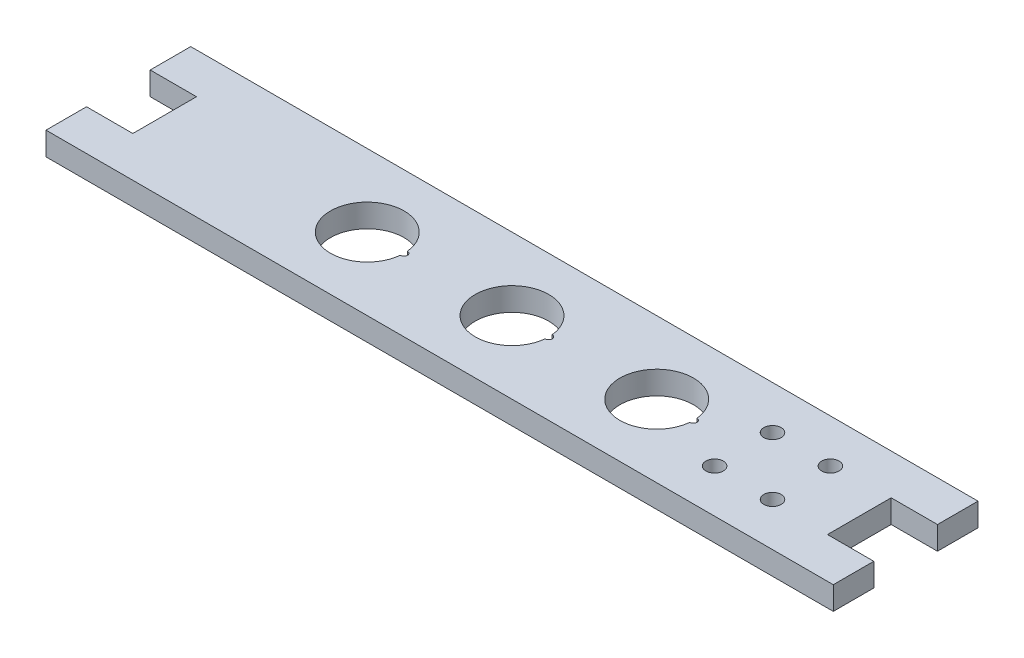
ISO-10303-21;
HEADER;
FILE_DESCRIPTION(('STEP AP214'),'2;1');
FILE_NAME('part.step','',(''),(''),'','','');
FILE_SCHEMA(('AUTOMOTIVE_DESIGN { 1 0 10303 214 1 1 1 1 }'));
ENDSEC;
DATA;
#1=APPLICATION_CONTEXT('core data for automotive mechanical design processes');
#2=APPLICATION_PROTOCOL_DEFINITION('international standard','automotive_design',2000,#1);
#3=PRODUCT_CONTEXT('',#1,'mechanical');
#4=PRODUCT('Part','Part','',(#3));
#5=PRODUCT_RELATED_PRODUCT_CATEGORY('part','',(#4));
#6=PRODUCT_DEFINITION_FORMATION('','',#4);
#7=PRODUCT_DEFINITION_CONTEXT('part definition',#1,'design');
#8=PRODUCT_DEFINITION('design','',#6,#7);
#9=PRODUCT_DEFINITION_SHAPE('','',#8);
#10=(LENGTH_UNIT() NAMED_UNIT(*) SI_UNIT(.MILLI.,.METRE.));
#11=(NAMED_UNIT(*) PLANE_ANGLE_UNIT() SI_UNIT($,.RADIAN.));
#12=(NAMED_UNIT(*) SI_UNIT($,.STERADIAN.) SOLID_ANGLE_UNIT());
#13=UNCERTAINTY_MEASURE_WITH_UNIT(LENGTH_MEASURE(1.E-05),#10,'distance_accuracy_value','');
#14=(GEOMETRIC_REPRESENTATION_CONTEXT(3) GLOBAL_UNCERTAINTY_ASSIGNED_CONTEXT((#13)) GLOBAL_UNIT_ASSIGNED_CONTEXT((#10,
#11,#12)) REPRESENTATION_CONTEXT('',''));
#15=CARTESIAN_POINT('',(0.,0.,0.));
#16=DIRECTION('',(0.,0.,1.));
#17=DIRECTION('',(1.,0.,0.));
#18=AXIS2_PLACEMENT_3D('',#15,#16,#17);
#19=CARTESIAN_POINT('',(-60.,4.,-12.5));
#20=DIRECTION('',(1.,0.,0.));
#21=DIRECTION('',(0.,0.,-1.));
#22=AXIS2_PLACEMENT_3D('',#19,#20,#21);
#23=PLANE('',#22);
#24=DIRECTION('',(0.,-1.,0.));
#25=VECTOR('',#24,1.);
#26=CARTESIAN_POINT('',(-60.,0.,5.49999999999997));
#27=LINE('',#26,#25);
#28=CARTESIAN_POINT('',(-60.,4.,5.49999999999997));
#29=VERTEX_POINT('',#28);
#30=CARTESIAN_POINT('',(-60.,0.,5.49999999999997));
#31=VERTEX_POINT('',#30);
#32=EDGE_CURVE('E207',#29,#31,#27,.T.);
#33=ORIENTED_EDGE('',*,*,#32,.F.);
#34=DIRECTION('',(0.,0.,1.));
#35=VECTOR('',#34,1.);
#36=CARTESIAN_POINT('',(-60.,4.,-12.5));
#37=LINE('',#36,#35);
#38=CARTESIAN_POINT('',(-60.,4.,-5.49999999999997));
#39=VERTEX_POINT('',#38);
#40=EDGE_CURVE('E319',#39,#29,#37,.T.);
#41=ORIENTED_EDGE('',*,*,#40,.F.);
#42=DIRECTION('',(0.,1.,0.));
#43=VECTOR('',#42,1.);
#44=CARTESIAN_POINT('',(-60.,0.,-5.49999999999997));
#45=LINE('',#44,#43);
#46=CARTESIAN_POINT('',(-60.,0.,-5.49999999999997));
#47=VERTEX_POINT('',#46);
#48=EDGE_CURVE('E224',#47,#39,#45,.T.);
#49=ORIENTED_EDGE('',*,*,#48,.F.);
#50=DIRECTION('',(0.,0.,1.));
#51=VECTOR('',#50,1.);
#52=CARTESIAN_POINT('',(-60.,0.,-12.5));
#53=LINE('',#52,#51);
#54=EDGE_CURVE('E318',#47,#31,#53,.T.);
#55=ORIENTED_EDGE('',*,*,#54,.T.);
#56=EDGE_LOOP('',(#33,#41,#49,#55));
#57=FACE_BOUND('',#56,.T.);
#58=ADVANCED_FACE('F35',(#57),#23,.F.);
#59=CARTESIAN_POINT('',(0.,4.,0.));
#60=DIRECTION('',(0.,1.,0.));
#61=DIRECTION('',(0.,0.,1.));
#62=AXIS2_PLACEMENT_3D('',#59,#60,#61);
#63=PLANE('',#62);
#64=CARTESIAN_POINT('',(50.,4.,-5.));
#65=DIRECTION('',(0.,1.,0.));
#66=DIRECTION('',(0.,0.,1.));
#67=AXIS2_PLACEMENT_3D('',#64,#65,#66);
#68=CIRCLE('',#67,1.5);
#69=CARTESIAN_POINT('',(50.,4.,-3.5));
#70=VERTEX_POINT('',#69);
#71=EDGE_CURVE('E250',#70,#70,#68,.T.);
#72=ORIENTED_EDGE('',*,*,#71,.F.);
#73=EDGE_LOOP('',(#72));
#74=FACE_BOUND('',#73,.T.);
#75=CARTESIAN_POINT('',(40.,4.,-5.));
#76=DIRECTION('',(0.,1.,0.));
#77=DIRECTION('',(0.,0.,1.));
#78=AXIS2_PLACEMENT_3D('',#75,#76,#77);
#79=CIRCLE('',#78,1.5);
#80=CARTESIAN_POINT('',(40.,4.,-3.5));
#81=VERTEX_POINT('',#80);
#82=EDGE_CURVE('E262',#81,#81,#79,.T.);
#83=ORIENTED_EDGE('',*,*,#82,.F.);
#84=EDGE_LOOP('',(#83));
#85=FACE_BOUND('',#84,.T.);
#86=DIRECTION('',(-1.,0.,0.));
#87=VECTOR('',#86,1.);
#88=CARTESIAN_POINT('',(-60.,4.,-12.5));
#89=LINE('',#88,#87);
#90=CARTESIAN_POINT('',(68.,4.,-12.5));
#91=VERTEX_POINT('',#90);
#92=CARTESIAN_POINT('',(-68.,4.,-12.5));
#93=VERTEX_POINT('',#92);
#94=EDGE_CURVE('E11',#91,#93,#89,.T.);
#95=ORIENTED_EDGE('',*,*,#94,.T.);
#96=DIRECTION('',(0.,0.,-1.));
#97=VECTOR('',#96,1.);
#98=CARTESIAN_POINT('',(-68.,4.,-12.5));
#99=LINE('',#98,#97);
#100=CARTESIAN_POINT('',(-68.,4.,-5.49999999999997));
#101=VERTEX_POINT('',#100);
#102=EDGE_CURVE('E232',#101,#93,#99,.T.);
#103=ORIENTED_EDGE('',*,*,#102,.F.);
#104=DIRECTION('',(1.,0.,0.));
#105=VECTOR('',#104,1.);
#106=CARTESIAN_POINT('',(-68.,4.,-5.49999999999997));
#107=LINE('',#106,#105);
#108=EDGE_CURVE('E235',#101,#39,#107,.T.);
#109=ORIENTED_EDGE('',*,*,#108,.T.);
#110=ORIENTED_EDGE('',*,*,#40,.T.);
#111=DIRECTION('',(1.,0.,0.));
#112=VECTOR('',#111,1.);
#113=CARTESIAN_POINT('',(-68.,4.,5.49999999999997));
#114=LINE('',#113,#112);
#115=CARTESIAN_POINT('',(-68.,4.,5.49999999999997));
#116=VERTEX_POINT('',#115);
#117=EDGE_CURVE('E222',#116,#29,#114,.T.);
#118=ORIENTED_EDGE('',*,*,#117,.F.);
#119=DIRECTION('',(0.,0.,-1.));
#120=VECTOR('',#119,1.);
#121=CARTESIAN_POINT('',(-68.,4.,12.5));
#122=LINE('',#121,#120);
#123=CARTESIAN_POINT('',(-68.,4.,12.5));
#124=VERTEX_POINT('',#123);
#125=EDGE_CURVE('E214',#124,#116,#122,.T.);
#126=ORIENTED_EDGE('',*,*,#125,.F.);
#127=DIRECTION('',(1.,0.,0.));
#128=VECTOR('',#127,1.);
#129=CARTESIAN_POINT('',(-60.,4.,12.5));
#130=LINE('',#129,#128);
#131=CARTESIAN_POINT('',(68.,4.,12.5));
#132=VERTEX_POINT('',#131);
#133=EDGE_CURVE('E322',#124,#132,#130,.T.);
#134=ORIENTED_EDGE('',*,*,#133,.T.);
#135=DIRECTION('',(0.,0.,-1.));
#136=VECTOR('',#135,1.);
#137=CARTESIAN_POINT('',(68.,4.,12.5));
#138=LINE('',#137,#136);
#139=CARTESIAN_POINT('',(68.,4.,5.49999999999997));
#140=VERTEX_POINT('',#139);
#141=EDGE_CURVE('E182',#132,#140,#138,.T.);
#142=ORIENTED_EDGE('',*,*,#141,.T.);
#143=DIRECTION('',(-1.,0.,0.));
#144=VECTOR('',#143,1.);
#145=CARTESIAN_POINT('',(68.,4.,5.49999999999997));
#146=LINE('',#145,#144);
#147=CARTESIAN_POINT('',(60.,4.,5.49999999999997));
#148=VERTEX_POINT('',#147);
#149=EDGE_CURVE('E170',#140,#148,#146,.T.);
#150=ORIENTED_EDGE('',*,*,#149,.T.);
#151=DIRECTION('',(0.,0.,-1.));
#152=VECTOR('',#151,1.);
#153=CARTESIAN_POINT('',(60.,4.,-12.5));
#154=LINE('',#153,#152);
#155=CARTESIAN_POINT('',(60.,4.,-5.49999999999997));
#156=VERTEX_POINT('',#155);
#157=EDGE_CURVE('E43',#148,#156,#154,.T.);
#158=ORIENTED_EDGE('',*,*,#157,.T.);
#159=DIRECTION('',(-1.,0.,0.));
#160=VECTOR('',#159,1.);
#161=CARTESIAN_POINT('',(68.,4.,-5.49999999999997));
#162=LINE('',#161,#160);
#163=CARTESIAN_POINT('',(68.,4.,-5.49999999999997));
#164=VERTEX_POINT('',#163);
#165=EDGE_CURVE('E204',#164,#156,#162,.T.);
#166=ORIENTED_EDGE('',*,*,#165,.F.);
#167=DIRECTION('',(0.,0.,-1.));
#168=VECTOR('',#167,1.);
#169=CARTESIAN_POINT('',(68.,4.,-12.5));
#170=LINE('',#169,#168);
#171=EDGE_CURVE('E192',#164,#91,#170,.T.);
#172=ORIENTED_EDGE('',*,*,#171,.T.);
#173=EDGE_LOOP('',(#95,#103,#109,#110,#118,#126,#134,#142,#150,#158,#166,#172));
#174=FACE_BOUND('',#173,.T.);
#175=CARTESIAN_POINT('',(31.35,4.,-1.74574066942157E-13));
#176=DIRECTION('',(0.,1.,0.));
#177=DIRECTION('',(0.,0.,-1.));
#178=AXIS2_PLACEMENT_3D('',#175,#176,#177);
#179=CIRCLE('',#178,0.6);
#180=CARTESIAN_POINT('',(31.3216535433071,4.,0.599330024604764));
#181=VERTEX_POINT('',#180);
#182=CARTESIAN_POINT('',(31.3216535433071,4.,-0.599330024605113));
#183=VERTEX_POINT('',#182);
#184=EDGE_CURVE('E305',#181,#183,#179,.T.);
#185=ORIENTED_EDGE('',*,*,#184,.F.);
#186=CARTESIAN_POINT('',(25.,4.,-1.74574066942157E-13));
#187=DIRECTION('',(0.,1.,0.));
#188=DIRECTION('',(0.,0.,1.));
#189=AXIS2_PLACEMENT_3D('',#186,#187,#188);
#190=CIRCLE('',#189,6.35);
#191=EDGE_CURVE('E302',#183,#181,#190,.T.);
#192=ORIENTED_EDGE('',*,*,#191,.F.);
#193=EDGE_LOOP('',(#185,#192));
#194=FACE_BOUND('',#193,.T.);
#195=CARTESIAN_POINT('',(6.35,4.,0.));
#196=DIRECTION('',(0.,1.,0.));
#197=DIRECTION('',(0.,0.,-1.));
#198=AXIS2_PLACEMENT_3D('',#195,#196,#197);
#199=CIRCLE('',#198,0.6);
#200=CARTESIAN_POINT('',(6.32165354330708,4.,0.599330024604939));
#201=VERTEX_POINT('',#200);
#202=CARTESIAN_POINT('',(6.32165354330708,4.,-0.599330024604939));
#203=VERTEX_POINT('',#202);
#204=EDGE_CURVE('E288',#201,#203,#199,.T.);
#205=ORIENTED_EDGE('',*,*,#204,.F.);
#206=CARTESIAN_POINT('',(0.,4.,0.));
#207=DIRECTION('',(0.,1.,0.));
#208=DIRECTION('',(0.,0.,1.));
#209=AXIS2_PLACEMENT_3D('',#206,#207,#208);
#210=CIRCLE('',#209,6.35);
#211=EDGE_CURVE('E285',#203,#201,#210,.T.);
#212=ORIENTED_EDGE('',*,*,#211,.F.);
#213=EDGE_LOOP('',(#205,#212));
#214=FACE_BOUND('',#213,.T.);
#215=CARTESIAN_POINT('',(-18.65,4.,1.74574066942157E-13));
#216=DIRECTION('',(0.,1.,0.));
#217=DIRECTION('',(0.,0.,-1.));
#218=AXIS2_PLACEMENT_3D('',#215,#216,#217);
#219=CIRCLE('',#218,0.6);
#220=CARTESIAN_POINT('',(-18.6783464566929,4.,0.599330024605113));
#221=VERTEX_POINT('',#220);
#222=CARTESIAN_POINT('',(-18.6783464566929,4.,-0.599330024604764));
#223=VERTEX_POINT('',#222);
#224=EDGE_CURVE('E271',#221,#223,#219,.T.);
#225=ORIENTED_EDGE('',*,*,#224,.F.);
#226=CARTESIAN_POINT('',(-25.,4.,1.74574066942157E-13));
#227=DIRECTION('',(0.,1.,0.));
#228=DIRECTION('',(0.,0.,1.));
#229=AXIS2_PLACEMENT_3D('',#226,#227,#228);
#230=CIRCLE('',#229,6.35);
#231=EDGE_CURVE('E268',#223,#221,#230,.T.);
#232=ORIENTED_EDGE('',*,*,#231,.F.);
#233=EDGE_LOOP('',(#225,#232));
#234=FACE_BOUND('',#233,.T.);
#235=CARTESIAN_POINT('',(40.,4.,5.));
#236=DIRECTION('',(0.,1.,0.));
#237=DIRECTION('',(0.,0.,-1.));
#238=AXIS2_PLACEMENT_3D('',#235,#236,#237);
#239=CIRCLE('',#238,1.5);
#240=CARTESIAN_POINT('',(40.,4.,3.5));
#241=VERTEX_POINT('',#240);
#242=EDGE_CURVE('E256',#241,#241,#239,.T.);
#243=ORIENTED_EDGE('',*,*,#242,.F.);
#244=EDGE_LOOP('',(#243));
#245=FACE_BOUND('',#244,.T.);
#246=CARTESIAN_POINT('',(50.,4.,5.));
#247=DIRECTION('',(0.,1.,0.));
#248=DIRECTION('',(0.,0.,-1.));
#249=AXIS2_PLACEMENT_3D('',#246,#247,#248);
#250=CIRCLE('',#249,1.5);
#251=CARTESIAN_POINT('',(50.,4.,3.5));
#252=VERTEX_POINT('',#251);
#253=EDGE_CURVE('E244',#252,#252,#250,.T.);
#254=ORIENTED_EDGE('',*,*,#253,.F.);
#255=EDGE_LOOP('',(#254));
#256=FACE_BOUND('',#255,.T.);
#257=ADVANCED_FACE('F341',(#74,#85,#174,#194,#214,#234,#245,#256),#63,.T.);
#258=CARTESIAN_POINT('',(0.,0.,0.));
#259=DIRECTION('',(0.,1.,0.));
#260=DIRECTION('',(0.,0.,1.));
#261=AXIS2_PLACEMENT_3D('',#258,#259,#260);
#262=PLANE('',#261);
#263=CARTESIAN_POINT('',(0.,0.,0.));
#264=DIRECTION('',(0.,1.,0.));
#265=DIRECTION('',(0.,0.,1.));
#266=AXIS2_PLACEMENT_3D('',#263,#264,#265);
#267=CIRCLE('',#266,6.35);
#268=CARTESIAN_POINT('',(6.32165354330708,0.,-0.599330024604939));
#269=VERTEX_POINT('',#268);
#270=CARTESIAN_POINT('',(6.32165354330708,0.,0.599330024604939));
#271=VERTEX_POINT('',#270);
#272=EDGE_CURVE('E284',#269,#271,#267,.T.);
#273=ORIENTED_EDGE('',*,*,#272,.T.);
#274=CARTESIAN_POINT('',(6.35,0.,0.));
#275=DIRECTION('',(0.,1.,0.));
#276=DIRECTION('',(0.,0.,-1.));
#277=AXIS2_PLACEMENT_3D('',#274,#275,#276);
#278=CIRCLE('',#277,0.6);
#279=EDGE_CURVE('E289',#271,#269,#278,.T.);
#280=ORIENTED_EDGE('',*,*,#279,.T.);
#281=EDGE_LOOP('',(#273,#280));
#282=FACE_BOUND('',#281,.T.);
#283=ORIENTED_EDGE('',*,*,#54,.F.);
#284=DIRECTION('',(1.,0.,0.));
#285=VECTOR('',#284,1.);
#286=CARTESIAN_POINT('',(-68.,0.,-5.49999999999997));
#287=LINE('',#286,#285);
#288=CARTESIAN_POINT('',(-68.,0.,-5.49999999999997));
#289=VERTEX_POINT('',#288);
#290=EDGE_CURVE('E240',#289,#47,#287,.T.);
#291=ORIENTED_EDGE('',*,*,#290,.F.);
#292=DIRECTION('',(0.,0.,1.));
#293=VECTOR('',#292,1.);
#294=CARTESIAN_POINT('',(-68.,0.,-12.5));
#295=LINE('',#294,#293);
#296=CARTESIAN_POINT('',(-68.,0.,-12.5));
#297=VERTEX_POINT('',#296);
#298=EDGE_CURVE('E228',#297,#289,#295,.T.);
#299=ORIENTED_EDGE('',*,*,#298,.F.);
#300=DIRECTION('',(-1.,0.,0.));
#301=VECTOR('',#300,1.);
#302=CARTESIAN_POINT('',(-60.,0.,-12.5));
#303=LINE('',#302,#301);
#304=CARTESIAN_POINT('',(68.,0.,-12.5));
#305=VERTEX_POINT('',#304);
#306=EDGE_CURVE('E38',#305,#297,#303,.T.);
#307=ORIENTED_EDGE('',*,*,#306,.F.);
#308=DIRECTION('',(0.,0.,1.));
#309=VECTOR('',#308,1.);
#310=CARTESIAN_POINT('',(68.,0.,-12.5));
#311=LINE('',#310,#309);
#312=CARTESIAN_POINT('',(68.,0.,-5.49999999999997));
#313=VERTEX_POINT('',#312);
#314=EDGE_CURVE('E198',#305,#313,#311,.T.);
#315=ORIENTED_EDGE('',*,*,#314,.T.);
#316=DIRECTION('',(-1.,0.,0.));
#317=VECTOR('',#316,1.);
#318=CARTESIAN_POINT('',(68.,0.,-5.49999999999997));
#319=LINE('',#318,#317);
#320=CARTESIAN_POINT('',(60.,0.,-5.49999999999997));
#321=VERTEX_POINT('',#320);
#322=EDGE_CURVE('E201',#313,#321,#319,.T.);
#323=ORIENTED_EDGE('',*,*,#322,.T.);
#324=DIRECTION('',(0.,0.,-1.));
#325=VECTOR('',#324,1.);
#326=CARTESIAN_POINT('',(60.,0.,-12.5));
#327=LINE('',#326,#325);
#328=CARTESIAN_POINT('',(60.,0.,5.49999999999997));
#329=VERTEX_POINT('',#328);
#330=EDGE_CURVE('E166',#329,#321,#327,.T.);
#331=ORIENTED_EDGE('',*,*,#330,.F.);
#332=DIRECTION('',(-1.,0.,0.));
#333=VECTOR('',#332,1.);
#334=CARTESIAN_POINT('',(68.,0.,5.49999999999997));
#335=LINE('',#334,#333);
#336=CARTESIAN_POINT('',(68.,0.,5.49999999999997));
#337=VERTEX_POINT('',#336);
#338=EDGE_CURVE('E158',#337,#329,#335,.T.);
#339=ORIENTED_EDGE('',*,*,#338,.F.);
#340=DIRECTION('',(0.,0.,1.));
#341=VECTOR('',#340,1.);
#342=CARTESIAN_POINT('',(68.,0.,12.5));
#343=LINE('',#342,#341);
#344=CARTESIAN_POINT('',(68.,0.,12.5));
#345=VERTEX_POINT('',#344);
#346=EDGE_CURVE('E163',#337,#345,#343,.T.);
#347=ORIENTED_EDGE('',*,*,#346,.T.);
#348=DIRECTION('',(1.,0.,0.));
#349=VECTOR('',#348,1.);
#350=CARTESIAN_POINT('',(-60.,0.,12.5));
#351=LINE('',#350,#349);
#352=CARTESIAN_POINT('',(-68.,0.,12.5));
#353=VERTEX_POINT('',#352);
#354=EDGE_CURVE('E327',#353,#345,#351,.T.);
#355=ORIENTED_EDGE('',*,*,#354,.F.);
#356=DIRECTION('',(0.,0.,1.));
#357=VECTOR('',#356,1.);
#358=CARTESIAN_POINT('',(-68.,0.,12.5));
#359=LINE('',#358,#357);
#360=CARTESIAN_POINT('',(-68.,0.,5.49999999999997));
#361=VERTEX_POINT('',#360);
#362=EDGE_CURVE('E208',#361,#353,#359,.T.);
#363=ORIENTED_EDGE('',*,*,#362,.F.);
#364=DIRECTION('',(1.,0.,0.));
#365=VECTOR('',#364,1.);
#366=CARTESIAN_POINT('',(-68.,0.,5.49999999999997));
#367=LINE('',#366,#365);
#368=EDGE_CURVE('E218',#361,#31,#367,.T.);
#369=ORIENTED_EDGE('',*,*,#368,.T.);
#370=EDGE_LOOP('',(#283,#291,#299,#307,#315,#323,#331,#339,#347,#355,#363,#369));
#371=FACE_BOUND('',#370,.T.);
#372=CARTESIAN_POINT('',(25.,0.,-1.74574066942157E-13));
#373=DIRECTION('',(0.,1.,0.));
#374=DIRECTION('',(0.,0.,1.));
#375=AXIS2_PLACEMENT_3D('',#372,#373,#374);
#376=CIRCLE('',#375,6.35);
#377=CARTESIAN_POINT('',(31.3216535433071,0.,-0.599330024605113));
#378=VERTEX_POINT('',#377);
#379=CARTESIAN_POINT('',(31.3216535433071,0.,0.599330024604764));
#380=VERTEX_POINT('',#379);
#381=EDGE_CURVE('E301',#378,#380,#376,.T.);
#382=ORIENTED_EDGE('',*,*,#381,.T.);
#383=CARTESIAN_POINT('',(31.35,0.,-1.74574066942157E-13));
#384=DIRECTION('',(0.,1.,0.));
#385=DIRECTION('',(0.,0.,-1.));
#386=AXIS2_PLACEMENT_3D('',#383,#384,#385);
#387=CIRCLE('',#386,0.6);
#388=EDGE_CURVE('E306',#380,#378,#387,.T.);
#389=ORIENTED_EDGE('',*,*,#388,.T.);
#390=EDGE_LOOP('',(#382,#389));
#391=FACE_BOUND('',#390,.T.);
#392=CARTESIAN_POINT('',(-25.,0.,1.74574066942157E-13));
#393=DIRECTION('',(0.,1.,0.));
#394=DIRECTION('',(0.,0.,1.));
#395=AXIS2_PLACEMENT_3D('',#392,#393,#394);
#396=CIRCLE('',#395,6.35);
#397=CARTESIAN_POINT('',(-18.6783464566929,0.,-0.599330024604764));
#398=VERTEX_POINT('',#397);
#399=CARTESIAN_POINT('',(-18.6783464566929,0.,0.599330024605113));
#400=VERTEX_POINT('',#399);
#401=EDGE_CURVE('E265',#398,#400,#396,.T.);
#402=ORIENTED_EDGE('',*,*,#401,.T.);
#403=CARTESIAN_POINT('',(-18.65,0.,1.74574066942157E-13));
#404=DIRECTION('',(0.,1.,0.));
#405=DIRECTION('',(0.,0.,-1.));
#406=AXIS2_PLACEMENT_3D('',#403,#404,#405);
#407=CIRCLE('',#406,0.6);
#408=EDGE_CURVE('E272',#400,#398,#407,.T.);
#409=ORIENTED_EDGE('',*,*,#408,.T.);
#410=EDGE_LOOP('',(#402,#409));
#411=FACE_BOUND('',#410,.T.);
#412=CARTESIAN_POINT('',(40.,0.,-5.));
#413=DIRECTION('',(0.,1.,0.));
#414=DIRECTION('',(0.,0.,1.));
#415=AXIS2_PLACEMENT_3D('',#412,#413,#414);
#416=CIRCLE('',#415,1.5);
#417=CARTESIAN_POINT('',(40.,0.,-3.5));
#418=VERTEX_POINT('',#417);
#419=EDGE_CURVE('E259',#418,#418,#416,.T.);
#420=ORIENTED_EDGE('',*,*,#419,.T.);
#421=EDGE_LOOP('',(#420));
#422=FACE_BOUND('',#421,.T.);
#423=CARTESIAN_POINT('',(40.,0.,5.));
#424=DIRECTION('',(0.,1.,0.));
#425=DIRECTION('',(0.,0.,-1.));
#426=AXIS2_PLACEMENT_3D('',#423,#424,#425);
#427=CIRCLE('',#426,1.5);
#428=CARTESIAN_POINT('',(40.,0.,3.5));
#429=VERTEX_POINT('',#428);
#430=EDGE_CURVE('E253',#429,#429,#427,.T.);
#431=ORIENTED_EDGE('',*,*,#430,.T.);
#432=EDGE_LOOP('',(#431));
#433=FACE_BOUND('',#432,.T.);
#434=CARTESIAN_POINT('',(50.,0.,-5.));
#435=DIRECTION('',(0.,1.,0.));
#436=DIRECTION('',(0.,0.,1.));
#437=AXIS2_PLACEMENT_3D('',#434,#435,#436);
#438=CIRCLE('',#437,1.5);
#439=CARTESIAN_POINT('',(50.,0.,-3.5));
#440=VERTEX_POINT('',#439);
#441=EDGE_CURVE('E247',#440,#440,#438,.T.);
#442=ORIENTED_EDGE('',*,*,#441,.T.);
#443=EDGE_LOOP('',(#442));
#444=FACE_BOUND('',#443,.T.);
#445=CARTESIAN_POINT('',(50.,0.,5.));
#446=DIRECTION('',(0.,1.,0.));
#447=DIRECTION('',(0.,0.,-1.));
#448=AXIS2_PLACEMENT_3D('',#445,#446,#447);
#449=CIRCLE('',#448,1.5);
#450=CARTESIAN_POINT('',(50.,0.,3.5));
#451=VERTEX_POINT('',#450);
#452=EDGE_CURVE('E243',#451,#451,#449,.T.);
#453=ORIENTED_EDGE('',*,*,#452,.T.);
#454=EDGE_LOOP('',(#453));
#455=FACE_BOUND('',#454,.T.);
#456=ADVANCED_FACE('F161',(#282,#371,#391,#411,#422,#433,#444,#455),#262,.F.);
#457=CARTESIAN_POINT('',(-60.,4.,12.5));
#458=DIRECTION('',(0.,0.,-1.));
#459=DIRECTION('',(-1.,0.,0.));
#460=AXIS2_PLACEMENT_3D('',#457,#458,#459);
#461=PLANE('',#460);
#462=ORIENTED_EDGE('',*,*,#354,.T.);
#463=DIRECTION('',(0.,1.,0.));
#464=VECTOR('',#463,1.);
#465=CARTESIAN_POINT('',(68.,0.,12.5));
#466=LINE('',#465,#464);
#467=EDGE_CURVE('E179',#345,#132,#466,.T.);
#468=ORIENTED_EDGE('',*,*,#467,.T.);
#469=ORIENTED_EDGE('',*,*,#133,.F.);
#470=DIRECTION('',(0.,1.,0.));
#471=VECTOR('',#470,1.);
#472=CARTESIAN_POINT('',(-68.,0.,12.5));
#473=LINE('',#472,#471);
#474=EDGE_CURVE('E211',#353,#124,#473,.T.);
#475=ORIENTED_EDGE('',*,*,#474,.F.);
#476=EDGE_LOOP('',(#462,#468,#469,#475));
#477=FACE_BOUND('',#476,.T.);
#478=ADVANCED_FACE('F352',(#477),#461,.F.);
#479=CARTESIAN_POINT('',(60.,4.,-12.5));
#480=DIRECTION('',(-1.,0.,0.));
#481=DIRECTION('',(0.,0.,1.));
#482=AXIS2_PLACEMENT_3D('',#479,#480,#481);
#483=PLANE('',#482);
#484=ORIENTED_EDGE('',*,*,#157,.F.);
#485=DIRECTION('',(0.,-1.,0.));
#486=VECTOR('',#485,1.);
#487=CARTESIAN_POINT('',(60.,0.,5.49999999999997));
#488=LINE('',#487,#486);
#489=EDGE_CURVE('E55',#148,#329,#488,.T.);
#490=ORIENTED_EDGE('',*,*,#489,.T.);
#491=ORIENTED_EDGE('',*,*,#330,.T.);
#492=DIRECTION('',(0.,1.,0.));
#493=VECTOR('',#492,1.);
#494=CARTESIAN_POINT('',(60.,0.,-5.49999999999997));
#495=LINE('',#494,#493);
#496=EDGE_CURVE('E169',#321,#156,#495,.T.);
#497=ORIENTED_EDGE('',*,*,#496,.T.);
#498=EDGE_LOOP('',(#484,#490,#491,#497));
#499=FACE_BOUND('',#498,.T.);
#500=ADVANCED_FACE('F350',(#499),#483,.F.);
#501=CARTESIAN_POINT('',(-60.,4.,-12.5));
#502=DIRECTION('',(0.,0.,1.));
#503=DIRECTION('',(1.,0.,0.));
#504=AXIS2_PLACEMENT_3D('',#501,#502,#503);
#505=PLANE('',#504);
#506=ORIENTED_EDGE('',*,*,#306,.T.);
#507=DIRECTION('',(0.,-1.,0.));
#508=VECTOR('',#507,1.);
#509=CARTESIAN_POINT('',(-68.,0.,-12.5));
#510=LINE('',#509,#508);
#511=EDGE_CURVE('E225',#93,#297,#510,.T.);
#512=ORIENTED_EDGE('',*,*,#511,.F.);
#513=ORIENTED_EDGE('',*,*,#94,.F.);
#514=DIRECTION('',(0.,-1.,0.));
#515=VECTOR('',#514,1.);
#516=CARTESIAN_POINT('',(68.,0.,-12.5));
#517=LINE('',#516,#515);
#518=EDGE_CURVE('E189',#91,#305,#517,.T.);
#519=ORIENTED_EDGE('',*,*,#518,.T.);
#520=EDGE_LOOP('',(#506,#512,#513,#519));
#521=FACE_BOUND('',#520,.T.);
#522=ADVANCED_FACE('F331',(#521),#505,.F.);
#523=CARTESIAN_POINT('',(25.,4.,-1.74574066942157E-13));
#524=DIRECTION('',(0.,-1.,0.));
#525=DIRECTION('',(0.,0.,-1.));
#526=AXIS2_PLACEMENT_3D('',#523,#524,#525);
#527=CYLINDRICAL_SURFACE('',#526,6.35);
#528=ORIENTED_EDGE('',*,*,#381,.F.);
#529=DIRECTION('',(0.,-1.,0.));
#530=VECTOR('',#529,1.);
#531=CARTESIAN_POINT('',(31.3216535433071,4.,-0.599330024605113));
#532=LINE('',#531,#530);
#533=EDGE_CURVE('E308',#183,#378,#532,.T.);
#534=ORIENTED_EDGE('',*,*,#533,.F.);
#535=ORIENTED_EDGE('',*,*,#191,.T.);
#536=DIRECTION('',(0.,-1.,0.));
#537=VECTOR('',#536,1.);
#538=CARTESIAN_POINT('',(31.3216535433071,4.,0.599330024604764));
#539=LINE('',#538,#537);
#540=EDGE_CURVE('E315',#181,#380,#539,.T.);
#541=ORIENTED_EDGE('',*,*,#540,.T.);
#542=EDGE_LOOP('',(#528,#534,#535,#541));
#543=FACE_BOUND('',#542,.T.);
#544=ADVANCED_FACE('F358',(#543),#527,.F.);
#545=CARTESIAN_POINT('',(31.35,4.,-1.74574066942157E-13));
#546=DIRECTION('',(0.,-1.,0.));
#547=DIRECTION('',(0.,0.,-1.));
#548=AXIS2_PLACEMENT_3D('',#545,#546,#547);
#549=CYLINDRICAL_SURFACE('',#548,0.6);
#550=ORIENTED_EDGE('',*,*,#388,.F.);
#551=ORIENTED_EDGE('',*,*,#540,.F.);
#552=ORIENTED_EDGE('',*,*,#184,.T.);
#553=ORIENTED_EDGE('',*,*,#533,.T.);
#554=EDGE_LOOP('',(#550,#551,#552,#553));
#555=FACE_BOUND('',#554,.T.);
#556=ADVANCED_FACE('F420',(#555),#549,.F.);
#557=CARTESIAN_POINT('',(0.,4.,0.));
#558=DIRECTION('',(0.,-1.,0.));
#559=DIRECTION('',(0.,0.,-1.));
#560=AXIS2_PLACEMENT_3D('',#557,#558,#559);
#561=CYLINDRICAL_SURFACE('',#560,6.35);
#562=ORIENTED_EDGE('',*,*,#272,.F.);
#563=DIRECTION('',(0.,-1.,0.));
#564=VECTOR('',#563,1.);
#565=CARTESIAN_POINT('',(6.32165354330708,4.,-0.599330024604939));
#566=LINE('',#565,#564);
#567=EDGE_CURVE('E291',#203,#269,#566,.T.);
#568=ORIENTED_EDGE('',*,*,#567,.F.);
#569=ORIENTED_EDGE('',*,*,#211,.T.);
#570=DIRECTION('',(0.,-1.,0.));
#571=VECTOR('',#570,1.);
#572=CARTESIAN_POINT('',(6.32165354330708,4.,0.599330024604939));
#573=LINE('',#572,#571);
#574=EDGE_CURVE('E298',#201,#271,#573,.T.);
#575=ORIENTED_EDGE('',*,*,#574,.T.);
#576=EDGE_LOOP('',(#562,#568,#569,#575));
#577=FACE_BOUND('',#576,.T.);
#578=ADVANCED_FACE('F416',(#577),#561,.F.);
#579=CARTESIAN_POINT('',(6.35,4.,0.));
#580=DIRECTION('',(0.,-1.,0.));
#581=DIRECTION('',(0.,0.,-1.));
#582=AXIS2_PLACEMENT_3D('',#579,#580,#581);
#583=CYLINDRICAL_SURFACE('',#582,0.6);
#584=ORIENTED_EDGE('',*,*,#279,.F.);
#585=ORIENTED_EDGE('',*,*,#574,.F.);
#586=ORIENTED_EDGE('',*,*,#204,.T.);
#587=ORIENTED_EDGE('',*,*,#567,.T.);
#588=EDGE_LOOP('',(#584,#585,#586,#587));
#589=FACE_BOUND('',#588,.T.);
#590=ADVANCED_FACE('F412',(#589),#583,.F.);
#591=CARTESIAN_POINT('',(-25.,4.,1.74574066942157E-13));
#592=DIRECTION('',(0.,-1.,0.));
#593=DIRECTION('',(0.,0.,-1.));
#594=AXIS2_PLACEMENT_3D('',#591,#592,#593);
#595=CYLINDRICAL_SURFACE('',#594,6.35);
#596=ORIENTED_EDGE('',*,*,#401,.F.);
#597=DIRECTION('',(0.,-1.,0.));
#598=VECTOR('',#597,1.);
#599=CARTESIAN_POINT('',(-18.6783464566929,4.,-0.599330024604764));
#600=LINE('',#599,#598);
#601=EDGE_CURVE('E274',#223,#398,#600,.T.);
#602=ORIENTED_EDGE('',*,*,#601,.F.);
#603=ORIENTED_EDGE('',*,*,#231,.T.);
#604=DIRECTION('',(0.,-1.,0.));
#605=VECTOR('',#604,1.);
#606=CARTESIAN_POINT('',(-18.6783464566929,4.,0.599330024605113));
#607=LINE('',#606,#605);
#608=EDGE_CURVE('E281',#221,#400,#607,.T.);
#609=ORIENTED_EDGE('',*,*,#608,.T.);
#610=EDGE_LOOP('',(#596,#602,#603,#609));
#611=FACE_BOUND('',#610,.T.);
#612=ADVANCED_FACE('F408',(#611),#595,.F.);
#613=CARTESIAN_POINT('',(-18.65,4.,1.74574066942157E-13));
#614=DIRECTION('',(0.,-1.,0.));
#615=DIRECTION('',(0.,0.,-1.));
#616=AXIS2_PLACEMENT_3D('',#613,#614,#615);
#617=CYLINDRICAL_SURFACE('',#616,0.6);
#618=ORIENTED_EDGE('',*,*,#408,.F.);
#619=ORIENTED_EDGE('',*,*,#608,.F.);
#620=ORIENTED_EDGE('',*,*,#224,.T.);
#621=ORIENTED_EDGE('',*,*,#601,.T.);
#622=EDGE_LOOP('',(#618,#619,#620,#621));
#623=FACE_BOUND('',#622,.T.);
#624=ADVANCED_FACE('F404',(#623),#617,.F.);
#625=CARTESIAN_POINT('',(40.,4.,-5.));
#626=DIRECTION('',(0.,-1.,0.));
#627=DIRECTION('',(0.,0.,-1.));
#628=AXIS2_PLACEMENT_3D('',#625,#626,#627);
#629=CYLINDRICAL_SURFACE('',#628,1.5);
#630=ORIENTED_EDGE('',*,*,#82,.T.);
#631=EDGE_LOOP('',(#630));
#632=FACE_BOUND('',#631,.T.);
#633=ORIENTED_EDGE('',*,*,#419,.F.);
#634=EDGE_LOOP('',(#633));
#635=FACE_BOUND('',#634,.T.);
#636=ADVANCED_FACE('F400',(#632,#635),#629,.F.);
#637=CARTESIAN_POINT('',(40.,4.,5.));
#638=DIRECTION('',(0.,-1.,0.));
#639=DIRECTION('',(0.,0.,-1.));
#640=AXIS2_PLACEMENT_3D('',#637,#638,#639);
#641=CYLINDRICAL_SURFACE('',#640,1.5);
#642=ORIENTED_EDGE('',*,*,#242,.T.);
#643=EDGE_LOOP('',(#642));
#644=FACE_BOUND('',#643,.T.);
#645=ORIENTED_EDGE('',*,*,#430,.F.);
#646=EDGE_LOOP('',(#645));
#647=FACE_BOUND('',#646,.T.);
#648=ADVANCED_FACE('F396',(#644,#647),#641,.F.);
#649=CARTESIAN_POINT('',(50.,4.,-5.));
#650=DIRECTION('',(0.,-1.,0.));
#651=DIRECTION('',(0.,0.,-1.));
#652=AXIS2_PLACEMENT_3D('',#649,#650,#651);
#653=CYLINDRICAL_SURFACE('',#652,1.5);
#654=ORIENTED_EDGE('',*,*,#71,.T.);
#655=EDGE_LOOP('',(#654));
#656=FACE_BOUND('',#655,.T.);
#657=ORIENTED_EDGE('',*,*,#441,.F.);
#658=EDGE_LOOP('',(#657));
#659=FACE_BOUND('',#658,.T.);
#660=ADVANCED_FACE('F389',(#656,#659),#653,.F.);
#661=CARTESIAN_POINT('',(50.,4.,5.));
#662=DIRECTION('',(0.,-1.,0.));
#663=DIRECTION('',(0.,0.,-1.));
#664=AXIS2_PLACEMENT_3D('',#661,#662,#663);
#665=CYLINDRICAL_SURFACE('',#664,1.5);
#666=ORIENTED_EDGE('',*,*,#253,.T.);
#667=EDGE_LOOP('',(#666));
#668=FACE_BOUND('',#667,.T.);
#669=ORIENTED_EDGE('',*,*,#452,.F.);
#670=EDGE_LOOP('',(#669));
#671=FACE_BOUND('',#670,.T.);
#672=ADVANCED_FACE('F382',(#668,#671),#665,.F.);
#673=CARTESIAN_POINT('',(-68.,0.,-5.49999999999997));
#674=DIRECTION('',(0.,0.,-1.));
#675=DIRECTION('',(-1.,0.,0.));
#676=AXIS2_PLACEMENT_3D('',#673,#674,#675);
#677=PLANE('',#676);
#678=ORIENTED_EDGE('',*,*,#48,.T.);
#679=ORIENTED_EDGE('',*,*,#108,.F.);
#680=DIRECTION('',(0.,1.,0.));
#681=VECTOR('',#680,1.);
#682=CARTESIAN_POINT('',(-68.,0.,-5.49999999999997));
#683=LINE('',#682,#681);
#684=EDGE_CURVE('E230',#289,#101,#683,.T.);
#685=ORIENTED_EDGE('',*,*,#684,.F.);
#686=ORIENTED_EDGE('',*,*,#290,.T.);
#687=EDGE_LOOP('',(#678,#679,#685,#686));
#688=FACE_BOUND('',#687,.T.);
#689=ADVANCED_FACE('F380',(#688),#677,.F.);
#690=CARTESIAN_POINT('',(-68.,0.,0.));
#691=DIRECTION('',(1.,0.,0.));
#692=DIRECTION('',(0.,0.,-1.));
#693=AXIS2_PLACEMENT_3D('',#690,#691,#692);
#694=PLANE('',#693);
#695=ORIENTED_EDGE('',*,*,#511,.T.);
#696=ORIENTED_EDGE('',*,*,#298,.T.);
#697=ORIENTED_EDGE('',*,*,#684,.T.);
#698=ORIENTED_EDGE('',*,*,#102,.T.);
#699=EDGE_LOOP('',(#695,#696,#697,#698));
#700=FACE_BOUND('',#699,.T.);
#701=ADVANCED_FACE('F337',(#700),#694,.F.);
#702=CARTESIAN_POINT('',(-68.,0.,5.49999999999997));
#703=DIRECTION('',(0.,0.,1.));
#704=DIRECTION('',(0.,-1.,0.));
#705=AXIS2_PLACEMENT_3D('',#702,#703,#704);
#706=PLANE('',#705);
#707=ORIENTED_EDGE('',*,*,#32,.T.);
#708=ORIENTED_EDGE('',*,*,#368,.F.);
#709=DIRECTION('',(0.,-1.,0.));
#710=VECTOR('',#709,1.);
#711=CARTESIAN_POINT('',(-68.,0.,5.49999999999997));
#712=LINE('',#711,#710);
#713=EDGE_CURVE('E216',#116,#361,#712,.T.);
#714=ORIENTED_EDGE('',*,*,#713,.F.);
#715=ORIENTED_EDGE('',*,*,#117,.T.);
#716=EDGE_LOOP('',(#707,#708,#714,#715));
#717=FACE_BOUND('',#716,.T.);
#718=ADVANCED_FACE('F374',(#717),#706,.F.);
#719=CARTESIAN_POINT('',(-68.,0.,0.));
#720=DIRECTION('',(1.,0.,0.));
#721=DIRECTION('',(0.,0.,-1.));
#722=AXIS2_PLACEMENT_3D('',#719,#720,#721);
#723=PLANE('',#722);
#724=ORIENTED_EDGE('',*,*,#362,.T.);
#725=ORIENTED_EDGE('',*,*,#474,.T.);
#726=ORIENTED_EDGE('',*,*,#125,.T.);
#727=ORIENTED_EDGE('',*,*,#713,.T.);
#728=EDGE_LOOP('',(#724,#725,#726,#727));
#729=FACE_BOUND('',#728,.T.);
#730=ADVANCED_FACE('F377',(#729),#723,.F.);
#731=CARTESIAN_POINT('',(68.,0.,-5.49999999999997));
#732=DIRECTION('',(0.,0.,1.));
#733=DIRECTION('',(1.,0.,0.));
#734=AXIS2_PLACEMENT_3D('',#731,#732,#733);
#735=PLANE('',#734);
#736=ORIENTED_EDGE('',*,*,#496,.F.);
#737=ORIENTED_EDGE('',*,*,#322,.F.);
#738=DIRECTION('',(0.,1.,0.));
#739=VECTOR('',#738,1.);
#740=CARTESIAN_POINT('',(68.,0.,-5.49999999999997));
#741=LINE('',#740,#739);
#742=EDGE_CURVE('E195',#313,#164,#741,.T.);
#743=ORIENTED_EDGE('',*,*,#742,.T.);
#744=ORIENTED_EDGE('',*,*,#165,.T.);
#745=EDGE_LOOP('',(#736,#737,#743,#744));
#746=FACE_BOUND('',#745,.T.);
#747=ADVANCED_FACE('F349',(#746),#735,.T.);
#748=CARTESIAN_POINT('',(68.,0.,0.));
#749=DIRECTION('',(-1.,0.,0.));
#750=DIRECTION('',(0.,0.,-1.));
#751=AXIS2_PLACEMENT_3D('',#748,#749,#750);
#752=PLANE('',#751);
#753=ORIENTED_EDGE('',*,*,#518,.F.);
#754=ORIENTED_EDGE('',*,*,#171,.F.);
#755=ORIENTED_EDGE('',*,*,#742,.F.);
#756=ORIENTED_EDGE('',*,*,#314,.F.);
#757=EDGE_LOOP('',(#753,#754,#755,#756));
#758=FACE_BOUND('',#757,.T.);
#759=ADVANCED_FACE('F345',(#758),#752,.F.);
#760=CARTESIAN_POINT('',(68.,0.,5.49999999999997));
#761=DIRECTION('',(0.,0.,-1.));
#762=DIRECTION('',(0.,1.,0.));
#763=AXIS2_PLACEMENT_3D('',#760,#761,#762);
#764=PLANE('',#763);
#765=ORIENTED_EDGE('',*,*,#489,.F.);
#766=ORIENTED_EDGE('',*,*,#149,.F.);
#767=DIRECTION('',(0.,-1.,0.));
#768=VECTOR('',#767,1.);
#769=CARTESIAN_POINT('',(68.,0.,5.49999999999997));
#770=LINE('',#769,#768);
#771=EDGE_CURVE('E176',#140,#337,#770,.T.);
#772=ORIENTED_EDGE('',*,*,#771,.T.);
#773=ORIENTED_EDGE('',*,*,#338,.T.);
#774=EDGE_LOOP('',(#765,#766,#772,#773));
#775=FACE_BOUND('',#774,.T.);
#776=ADVANCED_FACE('F181',(#775),#764,.T.);
#777=CARTESIAN_POINT('',(68.,0.,0.));
#778=DIRECTION('',(-1.,0.,0.));
#779=DIRECTION('',(0.,0.,-1.));
#780=AXIS2_PLACEMENT_3D('',#777,#778,#779);
#781=PLANE('',#780);
#782=ORIENTED_EDGE('',*,*,#346,.F.);
#783=ORIENTED_EDGE('',*,*,#771,.F.);
#784=ORIENTED_EDGE('',*,*,#141,.F.);
#785=ORIENTED_EDGE('',*,*,#467,.F.);
#786=EDGE_LOOP('',(#782,#783,#784,#785));
#787=FACE_BOUND('',#786,.T.);
#788=ADVANCED_FACE('F174',(#787),#781,.F.);
#789=CLOSED_SHELL('',(#58,#257,#456,#478,#500,#522,#544,#556,#578,#590,#612,#624,#636,#648,#660,
#672,#689,#701,#718,#730,#747,#759,#776,#788));
#790=MANIFOLD_SOLID_BREP('B2',#789);
#791=ADVANCED_BREP_SHAPE_REPRESENTATION('',(#18,#790),#14);
#792=SHAPE_DEFINITION_REPRESENTATION(#9,#791);
ENDSEC;
END-ISO-10303-21;
